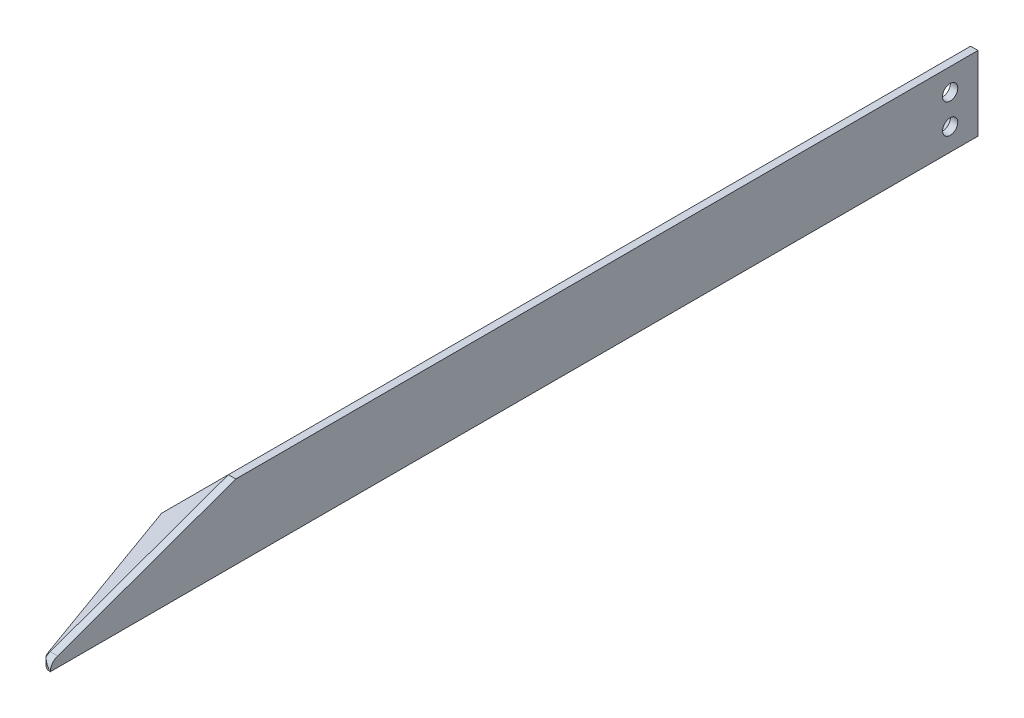
ISO-10303-21;
HEADER;
FILE_DESCRIPTION(('STEP AP214'),'2;1');
FILE_NAME('part.step','',(''),(''),'','','');
FILE_SCHEMA(('AUTOMOTIVE_DESIGN { 1 0 10303 214 1 1 1 1 }'));
ENDSEC;
DATA;
#1=APPLICATION_CONTEXT('core data for automotive mechanical design processes');
#2=APPLICATION_PROTOCOL_DEFINITION('international standard','automotive_design',2000,#1);
#3=PRODUCT_CONTEXT('',#1,'mechanical');
#4=PRODUCT('Part','Part','',(#3));
#5=PRODUCT_RELATED_PRODUCT_CATEGORY('part','',(#4));
#6=PRODUCT_DEFINITION_FORMATION('','',#4);
#7=PRODUCT_DEFINITION_CONTEXT('part definition',#1,'design');
#8=PRODUCT_DEFINITION('design','',#6,#7);
#9=PRODUCT_DEFINITION_SHAPE('','',#8);
#10=(LENGTH_UNIT() NAMED_UNIT(*) SI_UNIT(.MILLI.,.METRE.));
#11=(NAMED_UNIT(*) PLANE_ANGLE_UNIT() SI_UNIT($,.RADIAN.));
#12=(NAMED_UNIT(*) SI_UNIT($,.STERADIAN.) SOLID_ANGLE_UNIT());
#13=UNCERTAINTY_MEASURE_WITH_UNIT(LENGTH_MEASURE(1.E-05),#10,'distance_accuracy_value','');
#14=(GEOMETRIC_REPRESENTATION_CONTEXT(3) GLOBAL_UNCERTAINTY_ASSIGNED_CONTEXT((#13)) GLOBAL_UNIT_ASSIGNED_CONTEXT((#10,
#11,#12)) REPRESENTATION_CONTEXT('',''));
#15=CARTESIAN_POINT('',(0.,0.,0.));
#16=DIRECTION('',(0.,0.,1.));
#17=DIRECTION('',(1.,0.,0.));
#18=AXIS2_PLACEMENT_3D('',#15,#16,#17);
#19=CARTESIAN_POINT('',(-20.,0.,250.));
#20=DIRECTION('',(1.,0.,0.));
#21=DIRECTION('',(0.,0.,-1.));
#22=AXIS2_PLACEMENT_3D('',#19,#20,#21);
#23=PLANE('',#22);
#24=DIRECTION('',(0.,0.,-1.));
#25=VECTOR('',#24,1.);
#26=CARTESIAN_POINT('',(-20.,0.,250.));
#27=LINE('',#26,#25);
#28=CARTESIAN_POINT('',(-20.,0.,200.));
#29=VERTEX_POINT('',#28);
#30=CARTESIAN_POINT('',(-20.,0.,0.));
#31=VERTEX_POINT('',#30);
#32=EDGE_CURVE('E118',#29,#31,#27,.T.);
#33=ORIENTED_EDGE('',*,*,#32,.F.);
#34=DIRECTION('',(0.,1.,0.));
#35=VECTOR('',#34,1.);
#36=CARTESIAN_POINT('',(-20.,-8.,200.));
#37=LINE('',#36,#35);
#38=CARTESIAN_POINT('',(-20.,2.,200.));
#39=VERTEX_POINT('',#38);
#40=EDGE_CURVE('E106',#29,#39,#37,.T.);
#41=ORIENTED_EDGE('',*,*,#40,.T.);
#42=DIRECTION('',(0.,0.,-1.));
#43=VECTOR('',#42,1.);
#44=CARTESIAN_POINT('',(-20.,2.,250.));
#45=LINE('',#44,#43);
#46=CARTESIAN_POINT('',(-20.,2.,0.));
#47=VERTEX_POINT('',#46);
#48=EDGE_CURVE('E116',#39,#47,#45,.T.);
#49=ORIENTED_EDGE('',*,*,#48,.T.);
#50=DIRECTION('',(0.,-1.,0.));
#51=VECTOR('',#50,1.);
#52=CARTESIAN_POINT('',(-20.,0.,0.));
#53=LINE('',#52,#51);
#54=EDGE_CURVE('E168',#47,#31,#53,.T.);
#55=ORIENTED_EDGE('',*,*,#54,.T.);
#56=EDGE_LOOP('',(#33,#41,#49,#55));
#57=FACE_BOUND('',#56,.T.);
#58=ADVANCED_FACE('F34',(#57),#23,.F.);
#59=CARTESIAN_POINT('',(-20.,0.,250.));
#60=DIRECTION('',(0.,1.,0.));
#61=DIRECTION('',(0.,0.,1.));
#62=AXIS2_PLACEMENT_3D('',#59,#60,#61);
#63=PLANE('',#62);
#64=DIRECTION('',(0.,0.,-1.));
#65=VECTOR('',#64,1.);
#66=CARTESIAN_POINT('',(0.,0.,250.));
#67=LINE('',#66,#65);
#68=CARTESIAN_POINT('',(0.,0.,250.));
#69=VERTEX_POINT('',#68);
#70=CARTESIAN_POINT('',(0.,0.,0.));
#71=VERTEX_POINT('',#70);
#72=EDGE_CURVE('E136',#69,#71,#67,.T.);
#73=ORIENTED_EDGE('',*,*,#72,.F.);
#74=CARTESIAN_POINT('',(0.109194910152914,0.,247.001987913367));
#75=DIRECTION('',(0.,1.,0.));
#76=DIRECTION('',(0.,0.,1.));
#77=AXIS2_PLACEMENT_3D('',#74,#75,#76);
#78=CIRCLE('',#77,3.);
#79=CARTESIAN_POINT('',(-2.71346732545327,0.,248.018146318185));
#80=VERTEX_POINT('',#79);
#81=EDGE_CURVE('E140',#69,#80,#78,.F.);
#82=ORIENTED_EDGE('',*,*,#81,.T.);
#83=DIRECTION('',(-0.338719468272742,0.,-0.940887411868727));
#84=VECTOR('',#83,1.);
#85=CARTESIAN_POINT('',(-4.06515580736544,0.,244.263456090652));
#86=LINE('',#85,#84);
#87=EDGE_CURVE('E119',#80,#29,#86,.T.);
#88=ORIENTED_EDGE('',*,*,#87,.T.);
#89=ORIENTED_EDGE('',*,*,#32,.T.);
#90=DIRECTION('',(1.,0.,0.));
#91=VECTOR('',#90,1.);
#92=CARTESIAN_POINT('',(-20.,0.,0.));
#93=LINE('',#92,#91);
#94=EDGE_CURVE('E170',#31,#71,#93,.T.);
#95=ORIENTED_EDGE('',*,*,#94,.T.);
#96=EDGE_LOOP('',(#73,#82,#88,#89,#95));
#97=FACE_BOUND('',#96,.T.);
#98=ADVANCED_FACE('F188',(#97),#63,.F.);
#99=CARTESIAN_POINT('',(0.,0.,250.));
#100=DIRECTION('',(-1.,0.,0.));
#101=DIRECTION('',(0.,0.,1.));
#102=AXIS2_PLACEMENT_3D('',#99,#100,#101);
#103=PLANE('',#102);
#104=CARTESIAN_POINT('',(0.,14.,7.5));
#105=DIRECTION('',(1.,0.,0.));
#106=DIRECTION('',(0.,0.,-1.));
#107=AXIS2_PLACEMENT_3D('',#104,#105,#106);
#108=CIRCLE('',#107,2.05);
#109=CARTESIAN_POINT('',(0.,14.,5.45));
#110=VERTEX_POINT('',#109);
#111=EDGE_CURVE('E158',#110,#110,#108,.T.);
#112=ORIENTED_EDGE('',*,*,#111,.F.);
#113=EDGE_LOOP('',(#112));
#114=FACE_BOUND('',#113,.T.);
#115=CARTESIAN_POINT('',(0.,6.,7.5));
#116=DIRECTION('',(1.,0.,0.));
#117=DIRECTION('',(0.,0.,-1.));
#118=AXIS2_PLACEMENT_3D('',#115,#116,#117);
#119=CIRCLE('',#118,2.05);
#120=CARTESIAN_POINT('',(0.,6.,5.45));
#121=VERTEX_POINT('',#120);
#122=EDGE_CURVE('E150',#121,#121,#119,.T.);
#123=ORIENTED_EDGE('',*,*,#122,.F.);
#124=EDGE_LOOP('',(#123));
#125=FACE_BOUND('',#124,.T.);
#126=DIRECTION('',(0.,-0.338719468272742,0.940887411868727));
#127=VECTOR('',#126,1.);
#128=CARTESIAN_POINT('',(0.,1.77053824362606,250.637393767705));
#129=LINE('',#128,#127);
#130=CARTESIAN_POINT('',(0.,20.,200.));
#131=VERTEX_POINT('',#130);
#132=CARTESIAN_POINT('',(0.,2.71346732545327,248.018146318185));
#133=VERTEX_POINT('',#132);
#134=EDGE_CURVE('E166',#131,#133,#129,.T.);
#135=ORIENTED_EDGE('',*,*,#134,.T.);
#136=CARTESIAN_POINT('',(0.,-0.109194910152912,247.001987913367));
#137=DIRECTION('',(-1.,0.,0.));
#138=DIRECTION('',(0.,0.,1.));
#139=AXIS2_PLACEMENT_3D('',#136,#137,#138);
#140=CIRCLE('',#139,3.);
#141=EDGE_CURVE('E11',#133,#69,#140,.F.);
#142=ORIENTED_EDGE('',*,*,#141,.T.);
#143=ORIENTED_EDGE('',*,*,#72,.T.);
#144=DIRECTION('',(0.,1.,0.));
#145=VECTOR('',#144,1.);
#146=CARTESIAN_POINT('',(0.,0.,0.));
#147=LINE('',#146,#145);
#148=CARTESIAN_POINT('',(0.,20.,0.));
#149=VERTEX_POINT('',#148);
#150=EDGE_CURVE('E172',#71,#149,#147,.T.);
#151=ORIENTED_EDGE('',*,*,#150,.T.);
#152=DIRECTION('',(0.,0.,-1.));
#153=VECTOR('',#152,1.);
#154=CARTESIAN_POINT('',(0.,20.,250.));
#155=LINE('',#154,#153);
#156=EDGE_CURVE('E134',#131,#149,#155,.T.);
#157=ORIENTED_EDGE('',*,*,#156,.F.);
#158=EDGE_LOOP('',(#135,#142,#143,#151,#157));
#159=FACE_BOUND('',#158,.T.);
#160=ADVANCED_FACE('F191',(#114,#125,#159),#103,.F.);
#161=CARTESIAN_POINT('',(-2.,20.,250.));
#162=DIRECTION('',(0.,-1.,0.));
#163=DIRECTION('',(0.,0.,-1.));
#164=AXIS2_PLACEMENT_3D('',#161,#162,#163);
#165=PLANE('',#164);
#166=DIRECTION('',(0.,0.,-1.));
#167=VECTOR('',#166,1.);
#168=CARTESIAN_POINT('',(-2.,20.,250.));
#169=LINE('',#168,#167);
#170=CARTESIAN_POINT('',(-2.,20.,200.));
#171=VERTEX_POINT('',#170);
#172=CARTESIAN_POINT('',(-2.,20.,0.));
#173=VERTEX_POINT('',#172);
#174=EDGE_CURVE('E127',#171,#173,#169,.T.);
#175=ORIENTED_EDGE('',*,*,#174,.F.);
#176=DIRECTION('',(-1.,0.,0.));
#177=VECTOR('',#176,1.);
#178=CARTESIAN_POINT('',(8.,20.,200.));
#179=LINE('',#178,#177);
#180=EDGE_CURVE('E164',#131,#171,#179,.T.);
#181=ORIENTED_EDGE('',*,*,#180,.F.);
#182=ORIENTED_EDGE('',*,*,#156,.T.);
#183=DIRECTION('',(-1.,0.,0.));
#184=VECTOR('',#183,1.);
#185=CARTESIAN_POINT('',(-2.,20.,0.));
#186=LINE('',#185,#184);
#187=EDGE_CURVE('E175',#149,#173,#186,.T.);
#188=ORIENTED_EDGE('',*,*,#187,.T.);
#189=EDGE_LOOP('',(#175,#181,#182,#188));
#190=FACE_BOUND('',#189,.T.);
#191=ADVANCED_FACE('F215',(#190),#165,.F.);
#192=CARTESIAN_POINT('',(-2.,2.,250.));
#193=DIRECTION('',(1.,0.,0.));
#194=DIRECTION('',(0.,1.,0.));
#195=AXIS2_PLACEMENT_3D('',#192,#193,#194);
#196=PLANE('',#195);
#197=CARTESIAN_POINT('',(-2.,14.,7.5));
#198=DIRECTION('',(1.,0.,0.));
#199=DIRECTION('',(0.,1.,0.));
#200=AXIS2_PLACEMENT_3D('',#197,#198,#199);
#201=CIRCLE('',#200,2.05);
#202=CARTESIAN_POINT('',(-2.,16.05,7.5));
#203=VERTEX_POINT('',#202);
#204=EDGE_CURVE('E38',#203,#203,#201,.T.);
#205=ORIENTED_EDGE('',*,*,#204,.T.);
#206=EDGE_LOOP('',(#205));
#207=FACE_BOUND('',#206,.T.);
#208=CARTESIAN_POINT('',(-2.,6.,7.5));
#209=DIRECTION('',(1.,0.,0.));
#210=DIRECTION('',(0.,1.,0.));
#211=AXIS2_PLACEMENT_3D('',#208,#209,#210);
#212=CIRCLE('',#211,2.05);
#213=CARTESIAN_POINT('',(-2.,8.05,7.5));
#214=VERTEX_POINT('',#213);
#215=EDGE_CURVE('E148',#214,#214,#212,.T.);
#216=ORIENTED_EDGE('',*,*,#215,.T.);
#217=EDGE_LOOP('',(#216));
#218=FACE_BOUND('',#217,.T.);
#219=DIRECTION('',(0.,0.,-1.));
#220=VECTOR('',#219,1.);
#221=CARTESIAN_POINT('',(-2.,2.,250.));
#222=LINE('',#221,#220);
#223=CARTESIAN_POINT('',(-2.,2.,249.135364774352));
#224=VERTEX_POINT('',#223);
#225=CARTESIAN_POINT('',(-2.,2.,0.));
#226=VERTEX_POINT('',#225);
#227=EDGE_CURVE('E125',#224,#226,#222,.T.);
#228=ORIENTED_EDGE('',*,*,#227,.F.);
#229=CARTESIAN_POINT('',(-2.,-0.109194910152912,247.001987913367));
#230=DIRECTION('',(1.,0.,0.));
#231=DIRECTION('',(0.,1.,0.));
#232=AXIS2_PLACEMENT_3D('',#229,#230,#231);
#233=CIRCLE('',#232,3.);
#234=CARTESIAN_POINT('',(-2.,2.71346732545327,248.018146318185));
#235=VERTEX_POINT('',#234);
#236=EDGE_CURVE('E58',#224,#235,#233,.F.);
#237=ORIENTED_EDGE('',*,*,#236,.T.);
#238=DIRECTION('',(0.,-0.338719468272742,0.940887411868727));
#239=VECTOR('',#238,1.);
#240=CARTESIAN_POINT('',(-2.,2.,250.));
#241=LINE('',#240,#239);
#242=EDGE_CURVE('E162',#171,#235,#241,.T.);
#243=ORIENTED_EDGE('',*,*,#242,.F.);
#244=ORIENTED_EDGE('',*,*,#174,.T.);
#245=DIRECTION('',(0.,-1.,0.));
#246=VECTOR('',#245,1.);
#247=CARTESIAN_POINT('',(-2.,2.,0.));
#248=LINE('',#247,#246);
#249=EDGE_CURVE('E129',#173,#226,#248,.T.);
#250=ORIENTED_EDGE('',*,*,#249,.T.);
#251=EDGE_LOOP('',(#228,#237,#243,#244,#250));
#252=FACE_BOUND('',#251,.T.);
#253=ADVANCED_FACE('F179',(#207,#218,#252),#196,.F.);
#254=CARTESIAN_POINT('',(-20.,2.,250.));
#255=DIRECTION('',(0.,-1.,0.));
#256=DIRECTION('',(0.,0.,-1.));
#257=AXIS2_PLACEMENT_3D('',#254,#255,#256);
#258=PLANE('',#257);
#259=DIRECTION('',(-0.338719468272742,0.,-0.940887411868727));
#260=VECTOR('',#259,1.);
#261=CARTESIAN_POINT('',(-2.,2.,250.));
#262=LINE('',#261,#260);
#263=CARTESIAN_POINT('',(-2.71346732545327,2.,248.018146318185));
#264=VERTEX_POINT('',#263);
#265=EDGE_CURVE('E102',#264,#39,#262,.T.);
#266=ORIENTED_EDGE('',*,*,#265,.F.);
#267=CARTESIAN_POINT('',(0.109194910152914,2.,247.001987913367));
#268=DIRECTION('',(0.,-1.,0.));
#269=DIRECTION('',(0.,0.,-1.));
#270=AXIS2_PLACEMENT_3D('',#267,#268,#269);
#271=CIRCLE('',#270,3.);
#272=EDGE_CURVE('E143',#264,#224,#271,.F.);
#273=ORIENTED_EDGE('',*,*,#272,.T.);
#274=ORIENTED_EDGE('',*,*,#227,.T.);
#275=DIRECTION('',(-1.,0.,0.));
#276=VECTOR('',#275,1.);
#277=CARTESIAN_POINT('',(-20.,2.,0.));
#278=LINE('',#277,#276);
#279=EDGE_CURVE('E123',#226,#47,#278,.T.);
#280=ORIENTED_EDGE('',*,*,#279,.T.);
#281=ORIENTED_EDGE('',*,*,#48,.F.);
#282=EDGE_LOOP('',(#266,#273,#274,#280,#281));
#283=FACE_BOUND('',#282,.T.);
#284=ADVANCED_FACE('F121',(#283),#258,.F.);
#285=CARTESIAN_POINT('',(0.,0.,0.));
#286=DIRECTION('',(0.,0.,-1.));
#287=DIRECTION('',(-1.,0.,0.));
#288=AXIS2_PLACEMENT_3D('',#285,#286,#287);
#289=PLANE('',#288);
#290=ORIENTED_EDGE('',*,*,#54,.F.);
#291=ORIENTED_EDGE('',*,*,#279,.F.);
#292=ORIENTED_EDGE('',*,*,#249,.F.);
#293=ORIENTED_EDGE('',*,*,#187,.F.);
#294=ORIENTED_EDGE('',*,*,#150,.F.);
#295=ORIENTED_EDGE('',*,*,#94,.F.);
#296=EDGE_LOOP('',(#290,#291,#292,#293,#294,#295));
#297=FACE_BOUND('',#296,.T.);
#298=ADVANCED_FACE('F183',(#297),#289,.T.);
#299=CARTESIAN_POINT('',(8.,2.,250.));
#300=DIRECTION('',(0.,-0.940887411868727,-0.338719468272742));
#301=DIRECTION('',(0.,0.338719468272742,-0.940887411868727));
#302=AXIS2_PLACEMENT_3D('',#299,#300,#301);
#303=PLANE('',#302);
#304=ORIENTED_EDGE('',*,*,#242,.T.);
#305=DIRECTION('',(1.,0.,0.));
#306=VECTOR('',#305,1.);
#307=CARTESIAN_POINT('',(8.,2.71346732545327,248.018146318185));
#308=LINE('',#307,#306);
#309=EDGE_CURVE('E43',#235,#133,#308,.T.);
#310=ORIENTED_EDGE('',*,*,#309,.T.);
#311=ORIENTED_EDGE('',*,*,#134,.F.);
#312=ORIENTED_EDGE('',*,*,#180,.T.);
#313=EDGE_LOOP('',(#304,#310,#311,#312));
#314=FACE_BOUND('',#313,.T.);
#315=ADVANCED_FACE('F227',(#314),#303,.F.);
#316=CARTESIAN_POINT('',(-2.,-8.,250.));
#317=DIRECTION('',(0.940887411868727,0.,-0.338719468272742));
#318=DIRECTION('',(-0.338719468272742,0.,-0.940887411868727));
#319=AXIS2_PLACEMENT_3D('',#316,#317,#318);
#320=PLANE('',#319);
#321=ORIENTED_EDGE('',*,*,#87,.F.);
#322=DIRECTION('',(0.,1.,0.));
#323=VECTOR('',#322,1.);
#324=CARTESIAN_POINT('',(-2.71346732545327,-8.,248.018146318185));
#325=LINE('',#324,#323);
#326=EDGE_CURVE('E109',#80,#264,#325,.T.);
#327=ORIENTED_EDGE('',*,*,#326,.T.);
#328=ORIENTED_EDGE('',*,*,#265,.T.);
#329=ORIENTED_EDGE('',*,*,#40,.F.);
#330=EDGE_LOOP('',(#321,#327,#328,#329));
#331=FACE_BOUND('',#330,.T.);
#332=ADVANCED_FACE('F105',(#331),#320,.F.);
#333=CARTESIAN_POINT('',(0.,-0.109194910152912,247.001987913367));
#334=DIRECTION('',(1.,0.,0.));
#335=DIRECTION('',(0.,0.,-1.));
#336=AXIS2_PLACEMENT_3D('',#333,#334,#335);
#337=CYLINDRICAL_SURFACE('',#336,3.);
#338=ORIENTED_EDGE('',*,*,#309,.F.);
#339=ORIENTED_EDGE('',*,*,#236,.F.);
#340=CARTESIAN_POINT('',(0.109194910152914,-0.109194910152912,247.001987913367));
#341=DIRECTION('',(0.707106781186547,0.707106781186547,0.));
#342=DIRECTION('',(0.707106781186547,-0.707106781186547,0.));
#343=AXIS2_PLACEMENT_3D('',#340,#341,#342);
#344=ELLIPSE('',#343,4.24264068711928,3.);
#345=EDGE_CURVE('E112',#69,#224,#344,.F.);
#346=ORIENTED_EDGE('',*,*,#345,.F.);
#347=ORIENTED_EDGE('',*,*,#141,.F.);
#348=EDGE_LOOP('',(#338,#339,#346,#347));
#349=FACE_BOUND('',#348,.T.);
#350=ADVANCED_FACE('F36',(#349),#337,.T.);
#351=CARTESIAN_POINT('',(0.109194910152914,0.,247.001987913367));
#352=DIRECTION('',(0.,1.,0.));
#353=DIRECTION('',(0.,0.,1.));
#354=AXIS2_PLACEMENT_3D('',#351,#352,#353);
#355=CYLINDRICAL_SURFACE('',#354,3.);
#356=ORIENTED_EDGE('',*,*,#272,.F.);
#357=ORIENTED_EDGE('',*,*,#326,.F.);
#358=ORIENTED_EDGE('',*,*,#81,.F.);
#359=ORIENTED_EDGE('',*,*,#345,.T.);
#360=EDGE_LOOP('',(#356,#357,#358,#359));
#361=FACE_BOUND('',#360,.T.);
#362=ADVANCED_FACE('F197',(#361),#355,.T.);
#363=CARTESIAN_POINT('',(-10.,6.,7.5));
#364=DIRECTION('',(1.,0.,0.));
#365=DIRECTION('',(0.,0.,-1.));
#366=AXIS2_PLACEMENT_3D('',#363,#364,#365);
#367=CYLINDRICAL_SURFACE('',#366,2.05);
#368=ORIENTED_EDGE('',*,*,#122,.T.);
#369=EDGE_LOOP('',(#368));
#370=FACE_BOUND('',#369,.T.);
#371=ORIENTED_EDGE('',*,*,#215,.F.);
#372=EDGE_LOOP('',(#371));
#373=FACE_BOUND('',#372,.T.);
#374=ADVANCED_FACE('F199',(#370,#373),#367,.F.);
#375=CARTESIAN_POINT('',(-10.,14.,7.5));
#376=DIRECTION('',(1.,0.,0.));
#377=DIRECTION('',(0.,0.,-1.));
#378=AXIS2_PLACEMENT_3D('',#375,#376,#377);
#379=CYLINDRICAL_SURFACE('',#378,2.05);
#380=ORIENTED_EDGE('',*,*,#111,.T.);
#381=EDGE_LOOP('',(#380));
#382=FACE_BOUND('',#381,.T.);
#383=ORIENTED_EDGE('',*,*,#204,.F.);
#384=EDGE_LOOP('',(#383));
#385=FACE_BOUND('',#384,.T.);
#386=ADVANCED_FACE('F204',(#382,#385),#379,.F.);
#387=CLOSED_SHELL('',(#58,#98,#160,#191,#253,#284,#298,#315,#332,#350,#362,#374,#386));
#388=MANIFOLD_SOLID_BREP('B2',#387);
#389=ADVANCED_BREP_SHAPE_REPRESENTATION('',(#18,#388),#14);
#390=SHAPE_DEFINITION_REPRESENTATION(#9,#389);
ENDSEC;
END-ISO-10303-21;
